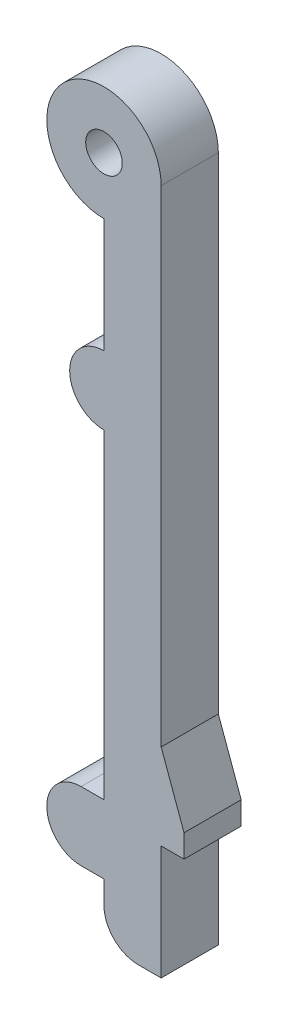
ISO-10303-21;
HEADER;
FILE_DESCRIPTION(('STEP AP214'),'2;1');
FILE_NAME('part.step','',(''),(''),'','','');
FILE_SCHEMA(('AUTOMOTIVE_DESIGN { 1 0 10303 214 1 1 1 1 }'));
ENDSEC;
DATA;
#1=APPLICATION_CONTEXT('core data for automotive mechanical design processes');
#2=APPLICATION_PROTOCOL_DEFINITION('international standard','automotive_design',2000,#1);
#3=PRODUCT_CONTEXT('',#1,'mechanical');
#4=PRODUCT('Part','Part','',(#3));
#5=PRODUCT_RELATED_PRODUCT_CATEGORY('part','',(#4));
#6=PRODUCT_DEFINITION_FORMATION('','',#4);
#7=PRODUCT_DEFINITION_CONTEXT('part definition',#1,'design');
#8=PRODUCT_DEFINITION('design','',#6,#7);
#9=PRODUCT_DEFINITION_SHAPE('','',#8);
#10=(LENGTH_UNIT() NAMED_UNIT(*) SI_UNIT(.MILLI.,.METRE.));
#11=(NAMED_UNIT(*) PLANE_ANGLE_UNIT() SI_UNIT($,.RADIAN.));
#12=(NAMED_UNIT(*) SI_UNIT($,.STERADIAN.) SOLID_ANGLE_UNIT());
#13=UNCERTAINTY_MEASURE_WITH_UNIT(LENGTH_MEASURE(1.E-05),#10,'distance_accuracy_value','');
#14=(GEOMETRIC_REPRESENTATION_CONTEXT(3) GLOBAL_UNCERTAINTY_ASSIGNED_CONTEXT((#13)) GLOBAL_UNIT_ASSIGNED_CONTEXT((#10,
#11,#12)) REPRESENTATION_CONTEXT('',''));
#15=CARTESIAN_POINT('',(0.,0.,0.));
#16=DIRECTION('',(0.,0.,1.));
#17=DIRECTION('',(1.,0.,0.));
#18=AXIS2_PLACEMENT_3D('',#15,#16,#17);
#19=CARTESIAN_POINT('',(0.,0.,5.));
#20=DIRECTION('',(0.,0.,1.));
#21=DIRECTION('',(1.,0.,0.));
#22=AXIS2_PLACEMENT_3D('',#19,#20,#21);
#23=PLANE('',#22);
#24=CARTESIAN_POINT('',(0.,60.,5.));
#25=DIRECTION('',(0.,0.,-1.));
#26=DIRECTION('',(-1.,0.,0.));
#27=AXIS2_PLACEMENT_3D('',#24,#25,#26);
#28=CIRCLE('',#27,1.6);
#29=CARTESIAN_POINT('',(-1.6,60.,5.));
#30=VERTEX_POINT('',#29);
#31=EDGE_CURVE('E258',#30,#30,#28,.T.);
#32=ORIENTED_EDGE('',*,*,#31,.T.);
#33=EDGE_LOOP('',(#32));
#34=FACE_BOUND('',#33,.T.);
#35=DIRECTION('',(0.,1.,0.));
#36=VECTOR('',#35,1.);
#37=CARTESIAN_POINT('',(0.,5.,5.));
#38=LINE('',#37,#36);
#39=CARTESIAN_POINT('',(0.,3.00000000000001,5.));
#40=VERTEX_POINT('',#39);
#41=CARTESIAN_POINT('',(0.,5.,5.));
#42=VERTEX_POINT('',#41);
#43=EDGE_CURVE('E213',#40,#42,#38,.T.);
#44=ORIENTED_EDGE('',*,*,#43,.F.);
#45=CARTESIAN_POINT('',(3.,3.00000000000001,5.));
#46=DIRECTION('',(0.,0.,1.));
#47=DIRECTION('',(1.,0.,0.));
#48=AXIS2_PLACEMENT_3D('',#45,#46,#47);
#49=CIRCLE('',#48,3.);
#50=CARTESIAN_POINT('',(3.,0.,5.));
#51=VERTEX_POINT('',#50);
#52=EDGE_CURVE('E11',#40,#51,#49,.T.);
#53=ORIENTED_EDGE('',*,*,#52,.T.);
#54=DIRECTION('',(1.,0.,0.));
#55=VECTOR('',#54,1.);
#56=CARTESIAN_POINT('',(0.,0.,5.));
#57=LINE('',#56,#55);
#58=CARTESIAN_POINT('',(5.,0.,5.));
#59=VERTEX_POINT('',#58);
#60=EDGE_CURVE('E312',#59,#51,#57,.F.);
#61=ORIENTED_EDGE('',*,*,#60,.F.);
#62=DIRECTION('',(0.,1.,0.));
#63=VECTOR('',#62,1.);
#64=CARTESIAN_POINT('',(5.,0.,5.));
#65=LINE('',#64,#63);
#66=CARTESIAN_POINT('',(5.,10.,5.));
#67=VERTEX_POINT('',#66);
#68=EDGE_CURVE('E197',#67,#59,#65,.F.);
#69=ORIENTED_EDGE('',*,*,#68,.F.);
#70=DIRECTION('',(1.,0.,0.));
#71=VECTOR('',#70,1.);
#72=CARTESIAN_POINT('',(5.,10.,5.));
#73=LINE('',#72,#71);
#74=CARTESIAN_POINT('',(7.,10.,5.));
#75=VERTEX_POINT('',#74);
#76=EDGE_CURVE('E186',#75,#67,#73,.F.);
#77=ORIENTED_EDGE('',*,*,#76,.F.);
#78=DIRECTION('',(0.,1.,0.));
#79=VECTOR('',#78,1.);
#80=CARTESIAN_POINT('',(7.,10.,5.));
#81=LINE('',#80,#79);
#82=CARTESIAN_POINT('',(7.,12.,5.));
#83=VERTEX_POINT('',#82);
#84=EDGE_CURVE('E170',#83,#75,#81,.F.);
#85=ORIENTED_EDGE('',*,*,#84,.F.);
#86=DIRECTION('',(0.342020143325662,-0.939692620785911,0.));
#87=VECTOR('',#86,1.);
#88=CARTESIAN_POINT('',(5.,17.4949548389094,5.));
#89=LINE('',#88,#87);
#90=CARTESIAN_POINT('',(5.,17.4949548389094,5.));
#91=VERTEX_POINT('',#90);
#92=EDGE_CURVE('E152',#83,#91,#89,.F.);
#93=ORIENTED_EDGE('',*,*,#92,.T.);
#94=DIRECTION('',(0.,1.,0.));
#95=VECTOR('',#94,1.);
#96=CARTESIAN_POINT('',(5.,12.,5.));
#97=LINE('',#96,#95);
#98=CARTESIAN_POINT('',(5.,60.,5.));
#99=VERTEX_POINT('',#98);
#100=EDGE_CURVE('E168',#99,#91,#97,.F.);
#101=ORIENTED_EDGE('',*,*,#100,.F.);
#102=CARTESIAN_POINT('',(0.,60.,5.));
#103=DIRECTION('',(0.,0.,1.));
#104=DIRECTION('',(1.,0.,0.));
#105=AXIS2_PLACEMENT_3D('',#102,#103,#104);
#106=CIRCLE('',#105,5.);
#107=CARTESIAN_POINT('',(0.,55.,5.));
#108=VERTEX_POINT('',#107);
#109=EDGE_CURVE('E241',#108,#99,#106,.F.);
#110=ORIENTED_EDGE('',*,*,#109,.F.);
#111=DIRECTION('',(0.,1.,0.));
#112=VECTOR('',#111,1.);
#113=CARTESIAN_POINT('',(0.,55.,5.));
#114=LINE('',#113,#112);
#115=CARTESIAN_POINT('',(0.,45.,5.));
#116=VERTEX_POINT('',#115);
#117=EDGE_CURVE('E238',#116,#108,#114,.T.);
#118=ORIENTED_EDGE('',*,*,#117,.F.);
#119=CARTESIAN_POINT('',(0.,42.,5.));
#120=DIRECTION('',(0.,0.,1.));
#121=DIRECTION('',(1.,0.,0.));
#122=AXIS2_PLACEMENT_3D('',#119,#120,#121);
#123=CIRCLE('',#122,3.);
#124=CARTESIAN_POINT('',(0.,39.,5.));
#125=VERTEX_POINT('',#124);
#126=EDGE_CURVE('E263',#125,#116,#123,.F.);
#127=ORIENTED_EDGE('',*,*,#126,.F.);
#128=DIRECTION('',(0.,-1.,0.));
#129=VECTOR('',#128,1.);
#130=CARTESIAN_POINT('',(0.,39.,5.));
#131=LINE('',#130,#129);
#132=CARTESIAN_POINT('',(0.,11.,5.));
#133=VERTEX_POINT('',#132);
#134=EDGE_CURVE('E233',#133,#125,#131,.F.);
#135=ORIENTED_EDGE('',*,*,#134,.F.);
#136=DIRECTION('',(-1.,0.,0.));
#137=VECTOR('',#136,1.);
#138=CARTESIAN_POINT('',(0.,11.,5.));
#139=LINE('',#138,#137);
#140=CARTESIAN_POINT('',(-2.,11.,5.));
#141=VERTEX_POINT('',#140);
#142=EDGE_CURVE('E227',#141,#133,#139,.F.);
#143=ORIENTED_EDGE('',*,*,#142,.F.);
#144=CARTESIAN_POINT('',(-2.,8.,5.));
#145=DIRECTION('',(0.,0.,1.));
#146=DIRECTION('',(1.,0.,0.));
#147=AXIS2_PLACEMENT_3D('',#144,#145,#146);
#148=CIRCLE('',#147,3.);
#149=CARTESIAN_POINT('',(-2.,5.,5.));
#150=VERTEX_POINT('',#149);
#151=EDGE_CURVE('E261',#150,#141,#148,.F.);
#152=ORIENTED_EDGE('',*,*,#151,.F.);
#153=DIRECTION('',(1.,0.,0.));
#154=VECTOR('',#153,1.);
#155=CARTESIAN_POINT('',(-2.,5.,5.));
#156=LINE('',#155,#154);
#157=EDGE_CURVE('E222',#42,#150,#156,.F.);
#158=ORIENTED_EDGE('',*,*,#157,.F.);
#159=EDGE_LOOP('',(#44,#53,#61,#69,#77,#85,#93,#101,#110,#118,#127,#135,#143,#152,#158));
#160=FACE_BOUND('',#159,.T.);
#161=ADVANCED_FACE('F35',(#34,#160),#23,.T.);
#162=CARTESIAN_POINT('',(0.,60.,0.));
#163=DIRECTION('',(0.,0.,1.));
#164=DIRECTION('',(1.,0.,0.));
#165=AXIS2_PLACEMENT_3D('',#162,#163,#164);
#166=CYLINDRICAL_SURFACE('',#165,5.);
#167=DIRECTION('',(0.,0.,-1.));
#168=VECTOR('',#167,1.);
#169=CARTESIAN_POINT('',(5.,60.,0.));
#170=LINE('',#169,#168);
#171=CARTESIAN_POINT('',(5.,60.,0.));
#172=VERTEX_POINT('',#171);
#173=EDGE_CURVE('E165',#172,#99,#170,.F.);
#174=ORIENTED_EDGE('',*,*,#173,.F.);
#175=CARTESIAN_POINT('',(0.,60.,0.));
#176=DIRECTION('',(0.,0.,1.));
#177=DIRECTION('',(1.,0.,0.));
#178=AXIS2_PLACEMENT_3D('',#175,#176,#177);
#179=CIRCLE('',#178,5.);
#180=CARTESIAN_POINT('',(0.,55.,0.));
#181=VERTEX_POINT('',#180);
#182=EDGE_CURVE('E255',#172,#181,#179,.T.);
#183=ORIENTED_EDGE('',*,*,#182,.T.);
#184=DIRECTION('',(0.,0.,1.));
#185=VECTOR('',#184,1.);
#186=CARTESIAN_POINT('',(0.,55.,0.));
#187=LINE('',#186,#185);
#188=EDGE_CURVE('E240',#108,#181,#187,.F.);
#189=ORIENTED_EDGE('',*,*,#188,.F.);
#190=ORIENTED_EDGE('',*,*,#109,.T.);
#191=EDGE_LOOP('',(#174,#183,#189,#190));
#192=FACE_BOUND('',#191,.T.);
#193=ADVANCED_FACE('F291',(#192),#166,.T.);
#194=CARTESIAN_POINT('',(0.,55.,0.));
#195=DIRECTION('',(-1.,0.,0.));
#196=DIRECTION('',(0.,0.,1.));
#197=AXIS2_PLACEMENT_3D('',#194,#195,#196);
#198=PLANE('',#197);
#199=ORIENTED_EDGE('',*,*,#188,.T.);
#200=DIRECTION('',(0.,1.,0.));
#201=VECTOR('',#200,1.);
#202=CARTESIAN_POINT('',(0.,0.,0.));
#203=LINE('',#202,#201);
#204=CARTESIAN_POINT('',(0.,45.,0.));
#205=VERTEX_POINT('',#204);
#206=EDGE_CURVE('E254',#181,#205,#203,.F.);
#207=ORIENTED_EDGE('',*,*,#206,.T.);
#208=DIRECTION('',(0.,0.,1.));
#209=VECTOR('',#208,1.);
#210=CARTESIAN_POINT('',(0.,45.,0.));
#211=LINE('',#210,#209);
#212=EDGE_CURVE('E235',#116,#205,#211,.F.);
#213=ORIENTED_EDGE('',*,*,#212,.F.);
#214=ORIENTED_EDGE('',*,*,#117,.T.);
#215=EDGE_LOOP('',(#199,#207,#213,#214));
#216=FACE_BOUND('',#215,.T.);
#217=ADVANCED_FACE('F285',(#216),#198,.T.);
#218=CARTESIAN_POINT('',(0.,42.,0.));
#219=DIRECTION('',(0.,0.,1.));
#220=DIRECTION('',(1.,0.,0.));
#221=AXIS2_PLACEMENT_3D('',#218,#219,#220);
#222=CYLINDRICAL_SURFACE('',#221,3.);
#223=ORIENTED_EDGE('',*,*,#212,.T.);
#224=CARTESIAN_POINT('',(0.,42.,0.));
#225=DIRECTION('',(0.,0.,1.));
#226=DIRECTION('',(1.,0.,0.));
#227=AXIS2_PLACEMENT_3D('',#224,#225,#226);
#228=CIRCLE('',#227,3.);
#229=CARTESIAN_POINT('',(0.,39.,0.));
#230=VERTEX_POINT('',#229);
#231=EDGE_CURVE('E250',#205,#230,#228,.T.);
#232=ORIENTED_EDGE('',*,*,#231,.T.);
#233=DIRECTION('',(0.,0.,1.));
#234=VECTOR('',#233,1.);
#235=CARTESIAN_POINT('',(0.,39.,0.));
#236=LINE('',#235,#234);
#237=EDGE_CURVE('E230',#125,#230,#236,.F.);
#238=ORIENTED_EDGE('',*,*,#237,.F.);
#239=ORIENTED_EDGE('',*,*,#126,.T.);
#240=EDGE_LOOP('',(#223,#232,#238,#239));
#241=FACE_BOUND('',#240,.T.);
#242=ADVANCED_FACE('F331',(#241),#222,.T.);
#243=CARTESIAN_POINT('',(0.,39.,0.));
#244=DIRECTION('',(-1.,0.,0.));
#245=DIRECTION('',(0.,-1.,0.));
#246=AXIS2_PLACEMENT_3D('',#243,#244,#245);
#247=PLANE('',#246);
#248=ORIENTED_EDGE('',*,*,#237,.T.);
#249=DIRECTION('',(0.,1.,0.));
#250=VECTOR('',#249,1.);
#251=CARTESIAN_POINT('',(0.,0.,0.));
#252=LINE('',#251,#250);
#253=CARTESIAN_POINT('',(0.,11.,0.));
#254=VERTEX_POINT('',#253);
#255=EDGE_CURVE('E253',#230,#254,#252,.F.);
#256=ORIENTED_EDGE('',*,*,#255,.T.);
#257=DIRECTION('',(0.,0.,1.));
#258=VECTOR('',#257,1.);
#259=CARTESIAN_POINT('',(0.,11.,0.));
#260=LINE('',#259,#258);
#261=EDGE_CURVE('E229',#133,#254,#260,.F.);
#262=ORIENTED_EDGE('',*,*,#261,.F.);
#263=ORIENTED_EDGE('',*,*,#134,.T.);
#264=EDGE_LOOP('',(#248,#256,#262,#263));
#265=FACE_BOUND('',#264,.T.);
#266=ADVANCED_FACE('F340',(#265),#247,.T.);
#267=CARTESIAN_POINT('',(0.,11.,0.));
#268=DIRECTION('',(0.,1.,0.));
#269=DIRECTION('',(-1.,0.,0.));
#270=AXIS2_PLACEMENT_3D('',#267,#268,#269);
#271=PLANE('',#270);
#272=ORIENTED_EDGE('',*,*,#261,.T.);
#273=DIRECTION('',(1.,0.,0.));
#274=VECTOR('',#273,1.);
#275=CARTESIAN_POINT('',(0.,11.,0.));
#276=LINE('',#275,#274);
#277=CARTESIAN_POINT('',(-2.,11.,0.));
#278=VERTEX_POINT('',#277);
#279=EDGE_CURVE('E249',#254,#278,#276,.F.);
#280=ORIENTED_EDGE('',*,*,#279,.T.);
#281=DIRECTION('',(0.,0.,1.));
#282=VECTOR('',#281,1.);
#283=CARTESIAN_POINT('',(-2.,11.,0.));
#284=LINE('',#283,#282);
#285=EDGE_CURVE('E224',#141,#278,#284,.F.);
#286=ORIENTED_EDGE('',*,*,#285,.F.);
#287=ORIENTED_EDGE('',*,*,#142,.T.);
#288=EDGE_LOOP('',(#272,#280,#286,#287));
#289=FACE_BOUND('',#288,.T.);
#290=ADVANCED_FACE('F343',(#289),#271,.T.);
#291=CARTESIAN_POINT('',(-2.,8.,0.));
#292=DIRECTION('',(0.,0.,1.));
#293=DIRECTION('',(1.,0.,0.));
#294=AXIS2_PLACEMENT_3D('',#291,#292,#293);
#295=CYLINDRICAL_SURFACE('',#294,3.);
#296=ORIENTED_EDGE('',*,*,#285,.T.);
#297=CARTESIAN_POINT('',(-2.,8.,0.));
#298=DIRECTION('',(0.,0.,1.));
#299=DIRECTION('',(1.,0.,0.));
#300=AXIS2_PLACEMENT_3D('',#297,#298,#299);
#301=CIRCLE('',#300,3.);
#302=CARTESIAN_POINT('',(-2.,5.,0.));
#303=VERTEX_POINT('',#302);
#304=EDGE_CURVE('E245',#278,#303,#301,.T.);
#305=ORIENTED_EDGE('',*,*,#304,.T.);
#306=DIRECTION('',(0.,0.,-1.));
#307=VECTOR('',#306,1.);
#308=CARTESIAN_POINT('',(-2.,5.,0.));
#309=LINE('',#308,#307);
#310=EDGE_CURVE('E216',#150,#303,#309,.T.);
#311=ORIENTED_EDGE('',*,*,#310,.F.);
#312=ORIENTED_EDGE('',*,*,#151,.T.);
#313=EDGE_LOOP('',(#296,#305,#311,#312));
#314=FACE_BOUND('',#313,.T.);
#315=ADVANCED_FACE('F348',(#314),#295,.T.);
#316=CARTESIAN_POINT('',(-2.,5.,0.));
#317=DIRECTION('',(0.,-1.,0.));
#318=DIRECTION('',(0.,0.,-1.));
#319=AXIS2_PLACEMENT_3D('',#316,#317,#318);
#320=PLANE('',#319);
#321=ORIENTED_EDGE('',*,*,#310,.T.);
#322=DIRECTION('',(1.,0.,0.));
#323=VECTOR('',#322,1.);
#324=CARTESIAN_POINT('',(0.,5.,0.));
#325=LINE('',#324,#323);
#326=CARTESIAN_POINT('',(0.,5.,0.));
#327=VERTEX_POINT('',#326);
#328=EDGE_CURVE('E248',#303,#327,#325,.T.);
#329=ORIENTED_EDGE('',*,*,#328,.T.);
#330=DIRECTION('',(0.,0.,1.));
#331=VECTOR('',#330,1.);
#332=CARTESIAN_POINT('',(0.,5.,0.));
#333=LINE('',#332,#331);
#334=EDGE_CURVE('E215',#42,#327,#333,.F.);
#335=ORIENTED_EDGE('',*,*,#334,.F.);
#336=ORIENTED_EDGE('',*,*,#157,.T.);
#337=EDGE_LOOP('',(#321,#329,#335,#336));
#338=FACE_BOUND('',#337,.T.);
#339=ADVANCED_FACE('F352',(#338),#320,.T.);
#340=CARTESIAN_POINT('',(0.,5.,0.));
#341=DIRECTION('',(-1.,0.,0.));
#342=DIRECTION('',(0.,0.,1.));
#343=AXIS2_PLACEMENT_3D('',#340,#341,#342);
#344=PLANE('',#343);
#345=DIRECTION('',(0.,1.,0.));
#346=VECTOR('',#345,1.);
#347=CARTESIAN_POINT('',(0.,0.,0.));
#348=LINE('',#347,#346);
#349=CARTESIAN_POINT('',(0.,3.00000000000001,0.));
#350=VERTEX_POINT('',#349);
#351=EDGE_CURVE('E202',#327,#350,#348,.F.);
#352=ORIENTED_EDGE('',*,*,#351,.T.);
#353=DIRECTION('',(0.,0.,-1.));
#354=VECTOR('',#353,1.);
#355=CARTESIAN_POINT('',(0.,3.00000000000001,0.));
#356=LINE('',#355,#354);
#357=EDGE_CURVE('E43',#350,#40,#356,.F.);
#358=ORIENTED_EDGE('',*,*,#357,.T.);
#359=ORIENTED_EDGE('',*,*,#43,.T.);
#360=ORIENTED_EDGE('',*,*,#334,.T.);
#361=EDGE_LOOP('',(#352,#358,#359,#360));
#362=FACE_BOUND('',#361,.T.);
#363=ADVANCED_FACE('F354',(#362),#344,.T.);
#364=CARTESIAN_POINT('',(0.,0.,0.));
#365=DIRECTION('',(0.,-1.,0.));
#366=DIRECTION('',(1.,0.,0.));
#367=AXIS2_PLACEMENT_3D('',#364,#365,#366);
#368=PLANE('',#367);
#369=ORIENTED_EDGE('',*,*,#60,.T.);
#370=DIRECTION('',(0.,0.,-1.));
#371=VECTOR('',#370,1.);
#372=CARTESIAN_POINT('',(3.,0.,0.));
#373=LINE('',#372,#371);
#374=CARTESIAN_POINT('',(3.,0.,0.));
#375=VERTEX_POINT('',#374);
#376=EDGE_CURVE('E209',#51,#375,#373,.T.);
#377=ORIENTED_EDGE('',*,*,#376,.T.);
#378=DIRECTION('',(1.,0.,0.));
#379=VECTOR('',#378,1.);
#380=CARTESIAN_POINT('',(0.,0.,0.));
#381=LINE('',#380,#379);
#382=CARTESIAN_POINT('',(5.,0.,0.));
#383=VERTEX_POINT('',#382);
#384=EDGE_CURVE('E191',#375,#383,#381,.T.);
#385=ORIENTED_EDGE('',*,*,#384,.T.);
#386=DIRECTION('',(0.,0.,-1.));
#387=VECTOR('',#386,1.);
#388=CARTESIAN_POINT('',(5.,0.,0.));
#389=LINE('',#388,#387);
#390=EDGE_CURVE('E194',#59,#383,#389,.T.);
#391=ORIENTED_EDGE('',*,*,#390,.F.);
#392=EDGE_LOOP('',(#369,#377,#385,#391));
#393=FACE_BOUND('',#392,.T.);
#394=ADVANCED_FACE('F360',(#393),#368,.T.);
#395=CARTESIAN_POINT('',(5.,0.,0.));
#396=DIRECTION('',(1.,0.,0.));
#397=DIRECTION('',(0.,0.,-1.));
#398=AXIS2_PLACEMENT_3D('',#395,#396,#397);
#399=PLANE('',#398);
#400=ORIENTED_EDGE('',*,*,#390,.T.);
#401=DIRECTION('',(0.,1.,0.));
#402=VECTOR('',#401,1.);
#403=CARTESIAN_POINT('',(5.,0.,0.));
#404=LINE('',#403,#402);
#405=CARTESIAN_POINT('',(5.,10.,0.));
#406=VERTEX_POINT('',#405);
#407=EDGE_CURVE('E181',#383,#406,#404,.T.);
#408=ORIENTED_EDGE('',*,*,#407,.T.);
#409=DIRECTION('',(0.,0.,1.));
#410=VECTOR('',#409,1.);
#411=CARTESIAN_POINT('',(5.,10.,0.));
#412=LINE('',#411,#410);
#413=EDGE_CURVE('E184',#67,#406,#412,.F.);
#414=ORIENTED_EDGE('',*,*,#413,.F.);
#415=ORIENTED_EDGE('',*,*,#68,.T.);
#416=EDGE_LOOP('',(#400,#408,#414,#415));
#417=FACE_BOUND('',#416,.T.);
#418=ADVANCED_FACE('F382',(#417),#399,.T.);
#419=CARTESIAN_POINT('',(5.,10.,0.));
#420=DIRECTION('',(0.,-1.,0.));
#421=DIRECTION('',(1.,0.,0.));
#422=AXIS2_PLACEMENT_3D('',#419,#420,#421);
#423=PLANE('',#422);
#424=ORIENTED_EDGE('',*,*,#413,.T.);
#425=DIRECTION('',(1.,0.,0.));
#426=VECTOR('',#425,1.);
#427=CARTESIAN_POINT('',(0.,10.,0.));
#428=LINE('',#427,#426);
#429=CARTESIAN_POINT('',(7.,10.,0.));
#430=VERTEX_POINT('',#429);
#431=EDGE_CURVE('E162',#406,#430,#428,.T.);
#432=ORIENTED_EDGE('',*,*,#431,.T.);
#433=DIRECTION('',(0.,0.,-1.));
#434=VECTOR('',#433,1.);
#435=CARTESIAN_POINT('',(7.,10.,0.));
#436=LINE('',#435,#434);
#437=EDGE_CURVE('E161',#75,#430,#436,.T.);
#438=ORIENTED_EDGE('',*,*,#437,.F.);
#439=ORIENTED_EDGE('',*,*,#76,.T.);
#440=EDGE_LOOP('',(#424,#432,#438,#439));
#441=FACE_BOUND('',#440,.T.);
#442=ADVANCED_FACE('F379',(#441),#423,.T.);
#443=CARTESIAN_POINT('',(7.,10.,0.));
#444=DIRECTION('',(1.,0.,0.));
#445=DIRECTION('',(0.,0.,-1.));
#446=AXIS2_PLACEMENT_3D('',#443,#444,#445);
#447=PLANE('',#446);
#448=ORIENTED_EDGE('',*,*,#437,.T.);
#449=DIRECTION('',(0.,1.,0.));
#450=VECTOR('',#449,1.);
#451=CARTESIAN_POINT('',(7.,0.,0.));
#452=LINE('',#451,#450);
#453=CARTESIAN_POINT('',(7.,12.,0.));
#454=VERTEX_POINT('',#453);
#455=EDGE_CURVE('E144',#430,#454,#452,.T.);
#456=ORIENTED_EDGE('',*,*,#455,.T.);
#457=DIRECTION('',(0.,0.,1.));
#458=VECTOR('',#457,1.);
#459=CARTESIAN_POINT('',(7.,12.,0.));
#460=LINE('',#459,#458);
#461=EDGE_CURVE('E158',#83,#454,#460,.F.);
#462=ORIENTED_EDGE('',*,*,#461,.F.);
#463=ORIENTED_EDGE('',*,*,#84,.T.);
#464=EDGE_LOOP('',(#448,#456,#462,#463));
#465=FACE_BOUND('',#464,.T.);
#466=ADVANCED_FACE('F157',(#465),#447,.T.);
#467=CARTESIAN_POINT('',(5.,12.,0.));
#468=DIRECTION('',(1.,0.,0.));
#469=DIRECTION('',(0.,0.,-1.));
#470=AXIS2_PLACEMENT_3D('',#467,#468,#469);
#471=PLANE('',#470);
#472=ORIENTED_EDGE('',*,*,#100,.T.);
#473=DIRECTION('',(0.,0.,-1.));
#474=VECTOR('',#473,1.);
#475=CARTESIAN_POINT('',(5.,17.4949548389094,0.));
#476=LINE('',#475,#474);
#477=CARTESIAN_POINT('',(5.,17.4949548389094,0.));
#478=VERTEX_POINT('',#477);
#479=EDGE_CURVE('E153',#91,#478,#476,.T.);
#480=ORIENTED_EDGE('',*,*,#479,.T.);
#481=DIRECTION('',(0.,1.,0.));
#482=VECTOR('',#481,1.);
#483=CARTESIAN_POINT('',(5.,0.,0.));
#484=LINE('',#483,#482);
#485=EDGE_CURVE('E147',#478,#172,#484,.T.);
#486=ORIENTED_EDGE('',*,*,#485,.T.);
#487=ORIENTED_EDGE('',*,*,#173,.T.);
#488=EDGE_LOOP('',(#472,#480,#486,#487));
#489=FACE_BOUND('',#488,.T.);
#490=ADVANCED_FACE('F296',(#489),#471,.T.);
#491=CARTESIAN_POINT('',(0.,60.,5.));
#492=DIRECTION('',(0.,0.,-1.));
#493=DIRECTION('',(-1.,0.,0.));
#494=AXIS2_PLACEMENT_3D('',#491,#492,#493);
#495=CYLINDRICAL_SURFACE('',#494,1.6);
#496=ORIENTED_EDGE('',*,*,#31,.F.);
#497=EDGE_LOOP('',(#496));
#498=FACE_BOUND('',#497,.T.);
#499=CARTESIAN_POINT('',(0.,60.,0.));
#500=DIRECTION('',(0.,0.,-1.));
#501=DIRECTION('',(-1.,0.,0.));
#502=AXIS2_PLACEMENT_3D('',#499,#500,#501);
#503=CIRCLE('',#502,1.6);
#504=CARTESIAN_POINT('',(-1.6,60.,0.));
#505=VERTEX_POINT('',#504);
#506=EDGE_CURVE('E242',#505,#505,#503,.T.);
#507=ORIENTED_EDGE('',*,*,#506,.T.);
#508=EDGE_LOOP('',(#507));
#509=FACE_BOUND('',#508,.T.);
#510=ADVANCED_FACE('F364',(#498,#509),#495,.F.);
#511=CARTESIAN_POINT('',(0.,0.,0.));
#512=DIRECTION('',(0.,0.,1.));
#513=DIRECTION('',(1.,0.,0.));
#514=AXIS2_PLACEMENT_3D('',#511,#512,#513);
#515=PLANE('',#514);
#516=ORIENTED_EDGE('',*,*,#506,.F.);
#517=EDGE_LOOP('',(#516));
#518=FACE_BOUND('',#517,.T.);
#519=ORIENTED_EDGE('',*,*,#384,.F.);
#520=CARTESIAN_POINT('',(3.,3.00000000000001,0.));
#521=DIRECTION('',(0.,0.,1.));
#522=DIRECTION('',(1.,0.,0.));
#523=AXIS2_PLACEMENT_3D('',#520,#521,#522);
#524=CIRCLE('',#523,3.);
#525=EDGE_CURVE('E57',#375,#350,#524,.F.);
#526=ORIENTED_EDGE('',*,*,#525,.T.);
#527=ORIENTED_EDGE('',*,*,#351,.F.);
#528=ORIENTED_EDGE('',*,*,#328,.F.);
#529=ORIENTED_EDGE('',*,*,#304,.F.);
#530=ORIENTED_EDGE('',*,*,#279,.F.);
#531=ORIENTED_EDGE('',*,*,#255,.F.);
#532=ORIENTED_EDGE('',*,*,#231,.F.);
#533=ORIENTED_EDGE('',*,*,#206,.F.);
#534=ORIENTED_EDGE('',*,*,#182,.F.);
#535=ORIENTED_EDGE('',*,*,#485,.F.);
#536=DIRECTION('',(-0.342020143325662,0.939692620785911,0.));
#537=VECTOR('',#536,1.);
#538=CARTESIAN_POINT('',(10.0378812090356,3.65348997518892,0.));
#539=LINE('',#538,#537);
#540=EDGE_CURVE('E140',#478,#454,#539,.F.);
#541=ORIENTED_EDGE('',*,*,#540,.T.);
#542=ORIENTED_EDGE('',*,*,#455,.F.);
#543=ORIENTED_EDGE('',*,*,#431,.F.);
#544=ORIENTED_EDGE('',*,*,#407,.F.);
#545=EDGE_LOOP('',(#519,#526,#527,#528,#529,#530,#531,#532,#533,#534,#535,#541,#542,#543,#544));
#546=FACE_BOUND('',#545,.T.);
#547=ADVANCED_FACE('F142',(#518,#546),#515,.F.);
#548=CARTESIAN_POINT('',(5.,17.4949548389094,0.));
#549=DIRECTION('',(0.939692620785911,0.342020143325662,0.));
#550=DIRECTION('',(0.,0.,1.));
#551=AXIS2_PLACEMENT_3D('',#548,#549,#550);
#552=PLANE('',#551);
#553=ORIENTED_EDGE('',*,*,#92,.F.);
#554=ORIENTED_EDGE('',*,*,#461,.T.);
#555=ORIENTED_EDGE('',*,*,#540,.F.);
#556=ORIENTED_EDGE('',*,*,#479,.F.);
#557=EDGE_LOOP('',(#553,#554,#555,#556));
#558=FACE_BOUND('',#557,.T.);
#559=ADVANCED_FACE('F164',(#558),#552,.T.);
#560=CARTESIAN_POINT('',(3.,3.00000000000001,0.));
#561=DIRECTION('',(0.,0.,-1.));
#562=DIRECTION('',(-1.,0.,0.));
#563=AXIS2_PLACEMENT_3D('',#560,#561,#562);
#564=CYLINDRICAL_SURFACE('',#563,3.);
#565=ORIENTED_EDGE('',*,*,#52,.F.);
#566=ORIENTED_EDGE('',*,*,#357,.F.);
#567=ORIENTED_EDGE('',*,*,#525,.F.);
#568=ORIENTED_EDGE('',*,*,#376,.F.);
#569=EDGE_LOOP('',(#565,#566,#567,#568));
#570=FACE_BOUND('',#569,.T.);
#571=ADVANCED_FACE('F37',(#570),#564,.T.);
#572=CLOSED_SHELL('',(#161,#193,#217,#242,#266,#290,#315,#339,#363,#394,#418,#442,#466,#490,
#510,#547,#559,#571));
#573=MANIFOLD_SOLID_BREP('B2',#572);
#574=ADVANCED_BREP_SHAPE_REPRESENTATION('',(#18,#573),#14);
#575=SHAPE_DEFINITION_REPRESENTATION(#9,#574);
ENDSEC;
END-ISO-10303-21;
